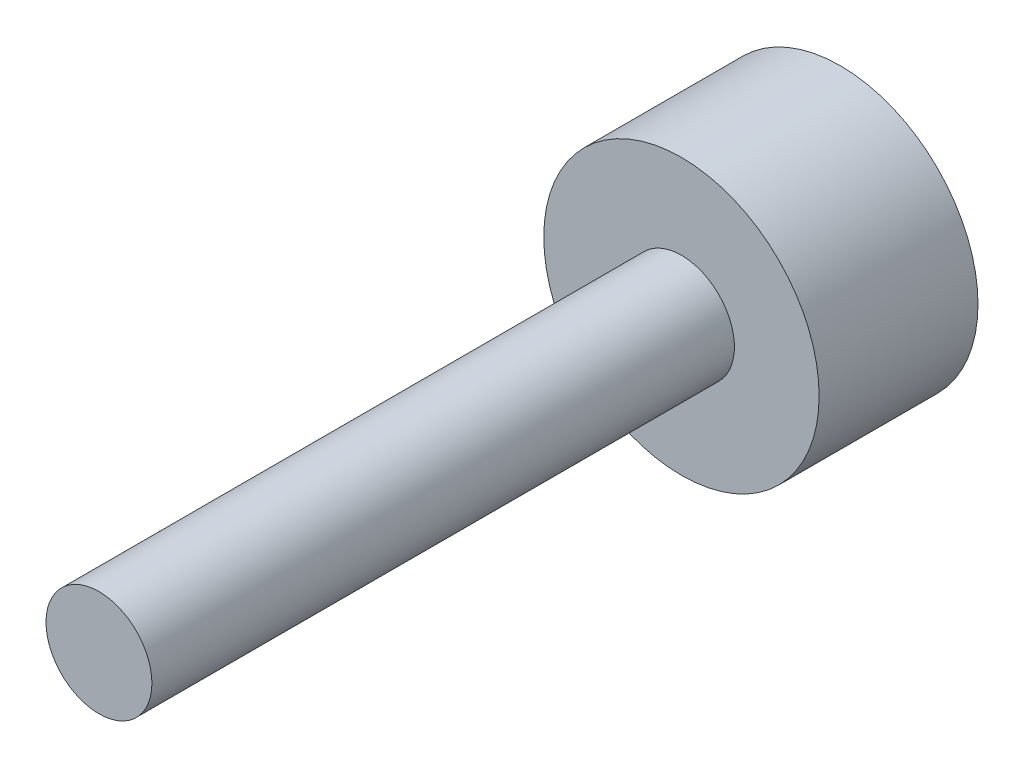
ISO-10303-21;
HEADER;
FILE_DESCRIPTION(('STEP AP214'),'2;1');
FILE_NAME('part.step','',(''),(''),'','','');
FILE_SCHEMA(('AUTOMOTIVE_DESIGN { 1 0 10303 214 1 1 1 1 }'));
ENDSEC;
DATA;
#1=APPLICATION_CONTEXT('core data for automotive mechanical design processes');
#2=APPLICATION_PROTOCOL_DEFINITION('international standard','automotive_design',2000,#1);
#3=PRODUCT_CONTEXT('',#1,'mechanical');
#4=PRODUCT('Part','Part','',(#3));
#5=PRODUCT_RELATED_PRODUCT_CATEGORY('part','',(#4));
#6=PRODUCT_DEFINITION_FORMATION('','',#4);
#7=PRODUCT_DEFINITION_CONTEXT('part definition',#1,'design');
#8=PRODUCT_DEFINITION('design','',#6,#7);
#9=PRODUCT_DEFINITION_SHAPE('','',#8);
#10=(LENGTH_UNIT() NAMED_UNIT(*) SI_UNIT(.MILLI.,.METRE.));
#11=(NAMED_UNIT(*) PLANE_ANGLE_UNIT() SI_UNIT($,.RADIAN.));
#12=(NAMED_UNIT(*) SI_UNIT($,.STERADIAN.) SOLID_ANGLE_UNIT());
#13=UNCERTAINTY_MEASURE_WITH_UNIT(LENGTH_MEASURE(1.E-05),#10,'distance_accuracy_value','');
#14=(GEOMETRIC_REPRESENTATION_CONTEXT(3) GLOBAL_UNCERTAINTY_ASSIGNED_CONTEXT((#13)) GLOBAL_UNIT_ASSIGNED_CONTEXT((#10,
#11,#12)) REPRESENTATION_CONTEXT('',''));
#15=CARTESIAN_POINT('',(0.,0.,0.));
#16=DIRECTION('',(0.,0.,1.));
#17=DIRECTION('',(1.,0.,0.));
#18=AXIS2_PLACEMENT_3D('',#15,#16,#17);
#19=CARTESIAN_POINT('',(0.,0.,60.));
#20=DIRECTION('',(0.,0.,-1.));
#21=DIRECTION('',(-1.,0.,0.));
#22=AXIS2_PLACEMENT_3D('',#19,#20,#21);
#23=CYLINDRICAL_SURFACE('',#22,5.);
#24=CARTESIAN_POINT('',(0.,0.,60.));
#25=DIRECTION('',(0.,0.,1.));
#26=DIRECTION('',(1.,0.,0.));
#27=AXIS2_PLACEMENT_3D('',#24,#25,#26);
#28=CIRCLE('',#27,5.);
#29=CARTESIAN_POINT('',(5.,0.,60.));
#30=VERTEX_POINT('',#29);
#31=EDGE_CURVE('E44',#30,#30,#28,.T.);
#32=ORIENTED_EDGE('',*,*,#31,.F.);
#33=EDGE_LOOP('',(#32));
#34=FACE_BOUND('',#33,.T.);
#35=CARTESIAN_POINT('',(0.,0.,5.));
#36=DIRECTION('',(0.,0.,-1.));
#37=DIRECTION('',(-1.,0.,0.));
#38=AXIS2_PLACEMENT_3D('',#35,#36,#37);
#39=CIRCLE('',#38,5.);
#40=CARTESIAN_POINT('',(-5.,0.,5.));
#41=VERTEX_POINT('',#40);
#42=EDGE_CURVE('E10',#41,#41,#39,.T.);
#43=ORIENTED_EDGE('',*,*,#42,.F.);
#44=EDGE_LOOP('',(#43));
#45=FACE_BOUND('',#44,.T.);
#46=ADVANCED_FACE('F37',(#34,#45),#23,.T.);
#47=CARTESIAN_POINT('',(0.,0.,60.));
#48=DIRECTION('',(0.,0.,1.));
#49=DIRECTION('',(1.,0.,0.));
#50=AXIS2_PLACEMENT_3D('',#47,#48,#49);
#51=PLANE('',#50);
#52=ORIENTED_EDGE('',*,*,#31,.T.);
#53=EDGE_LOOP('',(#52));
#54=FACE_BOUND('',#53,.T.);
#55=ADVANCED_FACE('F87',(#54),#51,.T.);
#56=CARTESIAN_POINT('',(0.,0.,-10.));
#57=DIRECTION('',(0.,0.,1.));
#58=DIRECTION('',(1.,0.,0.));
#59=AXIS2_PLACEMENT_3D('',#56,#57,#58);
#60=CYLINDRICAL_SURFACE('',#59,13.);
#61=CARTESIAN_POINT('',(0.,0.,-10.));
#62=DIRECTION('',(0.,0.,-1.));
#63=DIRECTION('',(-1.,0.,0.));
#64=AXIS2_PLACEMENT_3D('',#61,#62,#63);
#65=CIRCLE('',#64,13.);
#66=CARTESIAN_POINT('',(-13.,0.,-10.));
#67=VERTEX_POINT('',#66);
#68=EDGE_CURVE('E49',#67,#67,#65,.T.);
#69=ORIENTED_EDGE('',*,*,#68,.F.);
#70=EDGE_LOOP('',(#69));
#71=FACE_BOUND('',#70,.T.);
#72=CARTESIAN_POINT('',(0.,0.,5.));
#73=DIRECTION('',(0.,0.,-1.));
#74=DIRECTION('',(-1.,0.,0.));
#75=AXIS2_PLACEMENT_3D('',#72,#73,#74);
#76=CIRCLE('',#75,13.);
#77=CARTESIAN_POINT('',(-13.,0.,5.));
#78=VERTEX_POINT('',#77);
#79=EDGE_CURVE('E54',#78,#78,#76,.T.);
#80=ORIENTED_EDGE('',*,*,#79,.T.);
#81=EDGE_LOOP('',(#80));
#82=FACE_BOUND('',#81,.T.);
#83=ADVANCED_FACE('F81',(#71,#82),#60,.T.);
#84=CARTESIAN_POINT('',(0.,0.,-10.));
#85=DIRECTION('',(0.,0.,-1.));
#86=DIRECTION('',(-1.,0.,0.));
#87=AXIS2_PLACEMENT_3D('',#84,#85,#86);
#88=PLANE('',#87);
#89=CARTESIAN_POINT('',(0.,0.,-10.));
#90=DIRECTION('',(0.,0.,-1.));
#91=DIRECTION('',(-1.,0.,0.));
#92=AXIS2_PLACEMENT_3D('',#89,#90,#91);
#93=CIRCLE('',#92,5.);
#94=CARTESIAN_POINT('',(-5.,0.,-10.));
#95=VERTEX_POINT('',#94);
#96=EDGE_CURVE('E61',#95,#95,#93,.T.);
#97=ORIENTED_EDGE('',*,*,#96,.F.);
#98=EDGE_LOOP('',(#97));
#99=FACE_BOUND('',#98,.T.);
#100=ORIENTED_EDGE('',*,*,#68,.T.);
#101=EDGE_LOOP('',(#100));
#102=FACE_BOUND('',#101,.T.);
#103=ADVANCED_FACE('F78',(#99,#102),#88,.T.);
#104=CARTESIAN_POINT('',(0.,0.,5.));
#105=DIRECTION('',(0.,0.,-1.));
#106=DIRECTION('',(-1.,0.,0.));
#107=AXIS2_PLACEMENT_3D('',#104,#105,#106);
#108=PLANE('',#107);
#109=ORIENTED_EDGE('',*,*,#42,.T.);
#110=EDGE_LOOP('',(#109));
#111=FACE_BOUND('',#110,.T.);
#112=ORIENTED_EDGE('',*,*,#79,.F.);
#113=EDGE_LOOP('',(#112));
#114=FACE_BOUND('',#113,.T.);
#115=ADVANCED_FACE('F74',(#111,#114),#108,.F.);
#116=CARTESIAN_POINT('',(0.,0.,0.));
#117=DIRECTION('',(0.,0.,-1.));
#118=DIRECTION('',(-1.,0.,0.));
#119=AXIS2_PLACEMENT_3D('',#116,#117,#118);
#120=CYLINDRICAL_SURFACE('',#119,5.);
#121=CARTESIAN_POINT('',(0.,0.,0.));
#122=DIRECTION('',(0.,0.,-1.));
#123=DIRECTION('',(-1.,0.,0.));
#124=AXIS2_PLACEMENT_3D('',#121,#122,#123);
#125=CIRCLE('',#124,5.);
#126=CARTESIAN_POINT('',(-5.,0.,0.));
#127=VERTEX_POINT('',#126);
#128=EDGE_CURVE('E59',#127,#127,#125,.T.);
#129=ORIENTED_EDGE('',*,*,#128,.F.);
#130=EDGE_LOOP('',(#129));
#131=FACE_BOUND('',#130,.T.);
#132=ORIENTED_EDGE('',*,*,#96,.T.);
#133=EDGE_LOOP('',(#132));
#134=FACE_BOUND('',#133,.T.);
#135=ADVANCED_FACE('F71',(#131,#134),#120,.F.);
#136=CARTESIAN_POINT('',(0.,0.,0.));
#137=DIRECTION('',(0.,0.,-1.));
#138=DIRECTION('',(-1.,0.,0.));
#139=AXIS2_PLACEMENT_3D('',#136,#137,#138);
#140=PLANE('',#139);
#141=ORIENTED_EDGE('',*,*,#128,.T.);
#142=EDGE_LOOP('',(#141));
#143=FACE_BOUND('',#142,.T.);
#144=ADVANCED_FACE('F69',(#143),#140,.T.);
#145=CLOSED_SHELL('',(#46,#55,#83,#103,#115,#135,#144));
#146=MANIFOLD_SOLID_BREP('B2',#145);
#147=ADVANCED_BREP_SHAPE_REPRESENTATION('',(#18,#146),#14);
#148=SHAPE_DEFINITION_REPRESENTATION(#9,#147);
ENDSEC;
END-ISO-10303-21;
